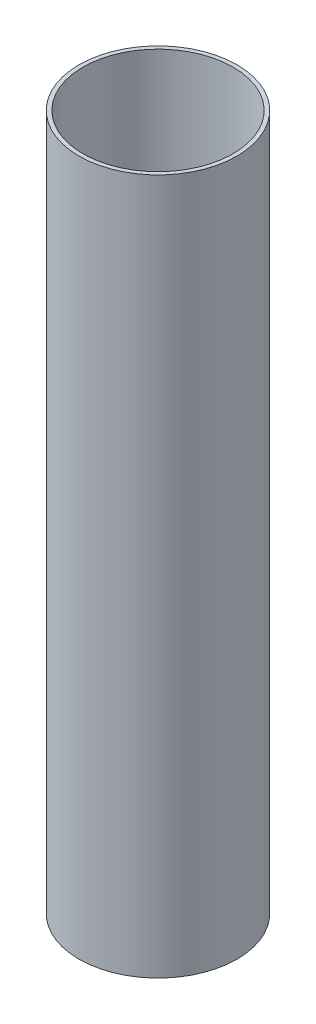
ISO-10303-21;
HEADER;
FILE_DESCRIPTION(('STEP AP214'),'2;1');
FILE_NAME('part.step','',(''),(''),'','','');
FILE_SCHEMA(('AUTOMOTIVE_DESIGN { 1 0 10303 214 1 1 1 1 }'));
ENDSEC;
DATA;
#1=APPLICATION_CONTEXT('core data for automotive mechanical design processes');
#2=APPLICATION_PROTOCOL_DEFINITION('international standard','automotive_design',2000,#1);
#3=PRODUCT_CONTEXT('',#1,'mechanical');
#4=PRODUCT('Part','Part','',(#3));
#5=PRODUCT_RELATED_PRODUCT_CATEGORY('part','',(#4));
#6=PRODUCT_DEFINITION_FORMATION('','',#4);
#7=PRODUCT_DEFINITION_CONTEXT('part definition',#1,'design');
#8=PRODUCT_DEFINITION('design','',#6,#7);
#9=PRODUCT_DEFINITION_SHAPE('','',#8);
#10=(LENGTH_UNIT() NAMED_UNIT(*) SI_UNIT(.MILLI.,.METRE.));
#11=(NAMED_UNIT(*) PLANE_ANGLE_UNIT() SI_UNIT($,.RADIAN.));
#12=(NAMED_UNIT(*) SI_UNIT($,.STERADIAN.) SOLID_ANGLE_UNIT());
#13=UNCERTAINTY_MEASURE_WITH_UNIT(LENGTH_MEASURE(1.E-05),#10,'distance_accuracy_value','');
#14=(GEOMETRIC_REPRESENTATION_CONTEXT(3) GLOBAL_UNCERTAINTY_ASSIGNED_CONTEXT((#13)) GLOBAL_UNIT_ASSIGNED_CONTEXT((#10,
#11,#12)) REPRESENTATION_CONTEXT('',''));
#15=CARTESIAN_POINT('',(0.,0.,0.));
#16=DIRECTION('',(0.,0.,1.));
#17=DIRECTION('',(1.,0.,0.));
#18=AXIS2_PLACEMENT_3D('',#15,#16,#17);
#19=CARTESIAN_POINT('',(0.,0.,0.));
#20=DIRECTION('',(0.,-1.,0.));
#21=DIRECTION('',(0.,0.,-1.));
#22=AXIS2_PLACEMENT_3D('',#19,#20,#21);
#23=CYLINDRICAL_SURFACE('',#22,60.325);
#24=CARTESIAN_POINT('',(0.,0.,0.));
#25=DIRECTION('',(0.,-1.,0.));
#26=DIRECTION('',(0.,0.,-1.));
#27=AXIS2_PLACEMENT_3D('',#24,#25,#26);
#28=CIRCLE('',#27,60.325);
#29=CARTESIAN_POINT('',(0.,0.,-60.325));
#30=VERTEX_POINT('',#29);
#31=EDGE_CURVE('E52',#30,#30,#28,.T.);
#32=ORIENTED_EDGE('',*,*,#31,.T.);
#33=EDGE_LOOP('',(#32));
#34=FACE_BOUND('',#33,.T.);
#35=CARTESIAN_POINT('',(0.,558.8,0.));
#36=DIRECTION('',(0.,-1.,0.));
#37=DIRECTION('',(0.,0.,-1.));
#38=AXIS2_PLACEMENT_3D('',#35,#36,#37);
#39=CIRCLE('',#38,60.325);
#40=CARTESIAN_POINT('',(0.,558.8,-60.325));
#41=VERTEX_POINT('',#40);
#42=EDGE_CURVE('E10',#41,#41,#39,.T.);
#43=ORIENTED_EDGE('',*,*,#42,.F.);
#44=EDGE_LOOP('',(#43));
#45=FACE_BOUND('',#44,.T.);
#46=ADVANCED_FACE('F38',(#34,#45),#23,.F.);
#47=CARTESIAN_POINT('',(60.325,558.8,0.));
#48=DIRECTION('',(0.,1.,0.));
#49=DIRECTION('',(0.,0.,1.));
#50=AXIS2_PLACEMENT_3D('',#47,#48,#49);
#51=PLANE('',#50);
#52=ORIENTED_EDGE('',*,*,#42,.T.);
#53=EDGE_LOOP('',(#52));
#54=FACE_BOUND('',#53,.T.);
#55=CARTESIAN_POINT('',(0.,558.8,0.));
#56=DIRECTION('',(0.,-1.,0.));
#57=DIRECTION('',(0.,0.,-1.));
#58=AXIS2_PLACEMENT_3D('',#55,#56,#57);
#59=CIRCLE('',#58,63.5);
#60=CARTESIAN_POINT('',(0.,558.8,-63.5));
#61=VERTEX_POINT('',#60);
#62=EDGE_CURVE('E44',#61,#61,#59,.T.);
#63=ORIENTED_EDGE('',*,*,#62,.F.);
#64=EDGE_LOOP('',(#63));
#65=FACE_BOUND('',#64,.T.);
#66=ADVANCED_FACE('F67',(#54,#65),#51,.T.);
#67=CARTESIAN_POINT('',(0.,0.,0.));
#68=DIRECTION('',(0.,-1.,0.));
#69=DIRECTION('',(0.,0.,-1.));
#70=AXIS2_PLACEMENT_3D('',#67,#68,#69);
#71=CYLINDRICAL_SURFACE('',#70,63.5);
#72=ORIENTED_EDGE('',*,*,#62,.T.);
#73=EDGE_LOOP('',(#72));
#74=FACE_BOUND('',#73,.T.);
#75=CARTESIAN_POINT('',(0.,0.,0.));
#76=DIRECTION('',(0.,-1.,0.));
#77=DIRECTION('',(0.,0.,-1.));
#78=AXIS2_PLACEMENT_3D('',#75,#76,#77);
#79=CIRCLE('',#78,63.5);
#80=CARTESIAN_POINT('',(0.,0.,-63.5));
#81=VERTEX_POINT('',#80);
#82=EDGE_CURVE('E48',#81,#81,#79,.T.);
#83=ORIENTED_EDGE('',*,*,#82,.F.);
#84=EDGE_LOOP('',(#83));
#85=FACE_BOUND('',#84,.T.);
#86=ADVANCED_FACE('F62',(#74,#85),#71,.T.);
#87=CARTESIAN_POINT('',(60.325,0.,0.));
#88=DIRECTION('',(0.,-1.,0.));
#89=DIRECTION('',(0.,0.,-1.));
#90=AXIS2_PLACEMENT_3D('',#87,#88,#89);
#91=PLANE('',#90);
#92=ORIENTED_EDGE('',*,*,#82,.T.);
#93=EDGE_LOOP('',(#92));
#94=FACE_BOUND('',#93,.T.);
#95=ORIENTED_EDGE('',*,*,#31,.F.);
#96=EDGE_LOOP('',(#95));
#97=FACE_BOUND('',#96,.T.);
#98=ADVANCED_FACE('F60',(#94,#97),#91,.T.);
#99=CLOSED_SHELL('',(#46,#66,#86,#98));
#100=MANIFOLD_SOLID_BREP('B2',#99);
#101=ADVANCED_BREP_SHAPE_REPRESENTATION('',(#18,#100),#14);
#102=SHAPE_DEFINITION_REPRESENTATION(#9,#101);
ENDSEC;
END-ISO-10303-21;
